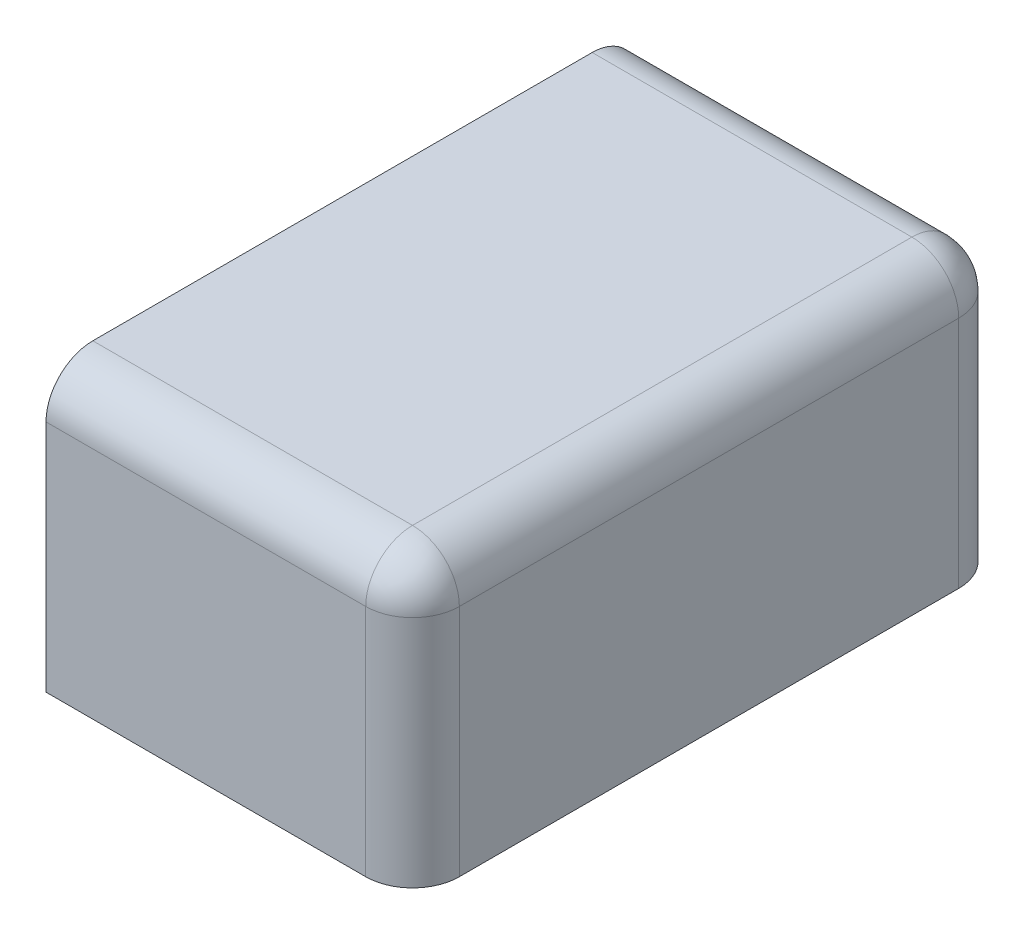
ISO-10303-21;
HEADER;
FILE_DESCRIPTION(('STEP AP214'),'2;1');
FILE_NAME('part.step','',(''),(''),'','','');
FILE_SCHEMA(('AUTOMOTIVE_DESIGN { 1 0 10303 214 1 1 1 1 }'));
ENDSEC;
DATA;
#1=APPLICATION_CONTEXT('core data for automotive mechanical design processes');
#2=APPLICATION_PROTOCOL_DEFINITION('international standard','automotive_design',2000,#1);
#3=PRODUCT_CONTEXT('',#1,'mechanical');
#4=PRODUCT('Part','Part','',(#3));
#5=PRODUCT_RELATED_PRODUCT_CATEGORY('part','',(#4));
#6=PRODUCT_DEFINITION_FORMATION('','',#4);
#7=PRODUCT_DEFINITION_CONTEXT('part definition',#1,'design');
#8=PRODUCT_DEFINITION('design','',#6,#7);
#9=PRODUCT_DEFINITION_SHAPE('','',#8);
#10=(LENGTH_UNIT() NAMED_UNIT(*) SI_UNIT(.MILLI.,.METRE.));
#11=(NAMED_UNIT(*) PLANE_ANGLE_UNIT() SI_UNIT($,.RADIAN.));
#12=(NAMED_UNIT(*) SI_UNIT($,.STERADIAN.) SOLID_ANGLE_UNIT());
#13=UNCERTAINTY_MEASURE_WITH_UNIT(LENGTH_MEASURE(1.E-05),#10,'distance_accuracy_value','');
#14=(GEOMETRIC_REPRESENTATION_CONTEXT(3) GLOBAL_UNCERTAINTY_ASSIGNED_CONTEXT((#13)) GLOBAL_UNIT_ASSIGNED_CONTEXT((#10,
#11,#12)) REPRESENTATION_CONTEXT('',''));
#15=CARTESIAN_POINT('',(0.,0.,0.));
#16=DIRECTION('',(0.,0.,1.));
#17=DIRECTION('',(1.,0.,0.));
#18=AXIS2_PLACEMENT_3D('',#15,#16,#17);
#19=CARTESIAN_POINT('',(-18.6436,28.575,30.1625));
#20=DIRECTION('',(1.,0.,0.));
#21=DIRECTION('',(0.,0.,-1.));
#22=AXIS2_PLACEMENT_3D('',#19,#20,#21);
#23=PLANE('',#22);
#24=DIRECTION('',(0.,-1.,0.));
#25=VECTOR('',#24,1.);
#26=CARTESIAN_POINT('',(-18.6436,28.575,-28.575));
#27=LINE('',#26,#25);
#28=CARTESIAN_POINT('',(-18.6436,23.8125,-28.575));
#29=VERTEX_POINT('',#28);
#30=CARTESIAN_POINT('',(-18.6436,0.,-28.575));
#31=VERTEX_POINT('',#30);
#32=EDGE_CURVE('E206',#29,#31,#27,.T.);
#33=ORIENTED_EDGE('',*,*,#32,.F.);
#34=CARTESIAN_POINT('',(-18.6436,23.8125,-25.4));
#35=DIRECTION('',(1.,0.,0.));
#36=DIRECTION('',(0.,0.,-1.));
#37=AXIS2_PLACEMENT_3D('',#34,#35,#36);
#38=CIRCLE('',#37,3.175);
#39=CARTESIAN_POINT('',(-18.6436,26.9875,-25.4));
#40=VERTEX_POINT('',#39);
#41=EDGE_CURVE('E189',#40,#29,#38,.F.);
#42=ORIENTED_EDGE('',*,*,#41,.F.);
#43=DIRECTION('',(0.,0.,1.));
#44=VECTOR('',#43,1.);
#45=CARTESIAN_POINT('',(-18.6436,26.9875,0.));
#46=LINE('',#45,#44);
#47=CARTESIAN_POINT('',(-18.6436,26.9875,25.4));
#48=VERTEX_POINT('',#47);
#49=EDGE_CURVE('E202',#40,#48,#46,.T.);
#50=ORIENTED_EDGE('',*,*,#49,.T.);
#51=CARTESIAN_POINT('',(-18.6436,23.8125,25.4));
#52=DIRECTION('',(1.,0.,0.));
#53=DIRECTION('',(0.,0.,-1.));
#54=AXIS2_PLACEMENT_3D('',#51,#52,#53);
#55=CIRCLE('',#54,3.175);
#56=CARTESIAN_POINT('',(-18.6436,23.8125,28.575));
#57=VERTEX_POINT('',#56);
#58=EDGE_CURVE('E207',#57,#48,#55,.F.);
#59=ORIENTED_EDGE('',*,*,#58,.F.);
#60=DIRECTION('',(0.,-1.,0.));
#61=VECTOR('',#60,1.);
#62=CARTESIAN_POINT('',(-18.6436,28.575,28.575));
#63=LINE('',#62,#61);
#64=CARTESIAN_POINT('',(-18.6436,0.,28.575));
#65=VERTEX_POINT('',#64);
#66=EDGE_CURVE('E203',#57,#65,#63,.T.);
#67=ORIENTED_EDGE('',*,*,#66,.T.);
#68=DIRECTION('',(0.,0.,1.));
#69=VECTOR('',#68,1.);
#70=CARTESIAN_POINT('',(-18.6436,0.,30.1625));
#71=LINE('',#70,#69);
#72=CARTESIAN_POINT('',(-18.6436,0.,30.1625));
#73=VERTEX_POINT('',#72);
#74=EDGE_CURVE('E229',#65,#73,#71,.T.);
#75=ORIENTED_EDGE('',*,*,#74,.T.);
#76=DIRECTION('',(0.,-1.,0.));
#77=VECTOR('',#76,1.);
#78=CARTESIAN_POINT('',(-18.6436,28.575,30.1625));
#79=LINE('',#78,#77);
#80=CARTESIAN_POINT('',(-18.6436,23.8125,30.1625));
#81=VERTEX_POINT('',#80);
#82=EDGE_CURVE('E222',#81,#73,#79,.T.);
#83=ORIENTED_EDGE('',*,*,#82,.F.);
#84=CARTESIAN_POINT('',(-18.6436,23.8125,25.4));
#85=DIRECTION('',(1.,0.,0.));
#86=DIRECTION('',(0.,0.,-1.));
#87=AXIS2_PLACEMENT_3D('',#84,#85,#86);
#88=CIRCLE('',#87,4.7625);
#89=CARTESIAN_POINT('',(-18.6436,28.575,25.4));
#90=VERTEX_POINT('',#89);
#91=EDGE_CURVE('E246',#81,#90,#88,.F.);
#92=ORIENTED_EDGE('',*,*,#91,.T.);
#93=DIRECTION('',(0.,0.,1.));
#94=VECTOR('',#93,1.);
#95=CARTESIAN_POINT('',(-18.6436,28.575,30.1625));
#96=LINE('',#95,#94);
#97=CARTESIAN_POINT('',(-18.6436,28.575,-25.4));
#98=VERTEX_POINT('',#97);
#99=EDGE_CURVE('E219',#98,#90,#96,.T.);
#100=ORIENTED_EDGE('',*,*,#99,.F.);
#101=CARTESIAN_POINT('',(-18.6436,23.8125,-25.4));
#102=DIRECTION('',(1.,0.,0.));
#103=DIRECTION('',(0.,0.,-1.));
#104=AXIS2_PLACEMENT_3D('',#101,#102,#103);
#105=CIRCLE('',#104,4.7625);
#106=CARTESIAN_POINT('',(-18.6436,23.8125,-30.1625));
#107=VERTEX_POINT('',#106);
#108=EDGE_CURVE('E248',#98,#107,#105,.F.);
#109=ORIENTED_EDGE('',*,*,#108,.T.);
#110=DIRECTION('',(0.,-1.,0.));
#111=VECTOR('',#110,1.);
#112=CARTESIAN_POINT('',(-18.6436,28.575,-30.1625));
#113=LINE('',#112,#111);
#114=CARTESIAN_POINT('',(-18.6436,0.,-30.1625));
#115=VERTEX_POINT('',#114);
#116=EDGE_CURVE('E236',#107,#115,#113,.T.);
#117=ORIENTED_EDGE('',*,*,#116,.T.);
#118=EDGE_CURVE('E230',#115,#31,#71,.T.);
#119=ORIENTED_EDGE('',*,*,#118,.T.);
#120=EDGE_LOOP('',(#33,#42,#50,#59,#67,#75,#83,#92,#100,#109,#117,#119));
#121=FACE_BOUND('',#120,.T.);
#122=ADVANCED_FACE('F35',(#121),#23,.F.);
#123=CARTESIAN_POINT('',(0.,0.,0.));
#124=DIRECTION('',(0.,-1.,0.));
#125=DIRECTION('',(0.,0.,-1.));
#126=AXIS2_PLACEMENT_3D('',#123,#124,#125);
#127=PLANE('',#126);
#128=CARTESIAN_POINT('',(13.8811,0.,-25.4));
#129=DIRECTION('',(0.,-1.,0.));
#130=DIRECTION('',(0.,0.,-1.));
#131=AXIS2_PLACEMENT_3D('',#128,#129,#130);
#132=CIRCLE('',#131,3.175);
#133=CARTESIAN_POINT('',(13.8811,0.,-28.575));
#134=VERTEX_POINT('',#133);
#135=CARTESIAN_POINT('',(17.0561,0.,-25.4));
#136=VERTEX_POINT('',#135);
#137=EDGE_CURVE('E157',#134,#136,#132,.T.);
#138=ORIENTED_EDGE('',*,*,#137,.F.);
#139=DIRECTION('',(-1.,0.,0.));
#140=VECTOR('',#139,1.);
#141=CARTESIAN_POINT('',(0.,0.,-28.575));
#142=LINE('',#141,#140);
#143=EDGE_CURVE('E194',#134,#31,#142,.T.);
#144=ORIENTED_EDGE('',*,*,#143,.T.);
#145=ORIENTED_EDGE('',*,*,#118,.F.);
#146=DIRECTION('',(-1.,0.,0.));
#147=VECTOR('',#146,1.);
#148=CARTESIAN_POINT('',(-18.6436,0.,-30.1625));
#149=LINE('',#148,#147);
#150=CARTESIAN_POINT('',(13.8811,0.,-30.1625));
#151=VERTEX_POINT('',#150);
#152=EDGE_CURVE('E227',#151,#115,#149,.T.);
#153=ORIENTED_EDGE('',*,*,#152,.F.);
#154=CARTESIAN_POINT('',(13.8811,0.,-25.4));
#155=DIRECTION('',(0.,-1.,0.));
#156=DIRECTION('',(0.,0.,-1.));
#157=AXIS2_PLACEMENT_3D('',#154,#155,#156);
#158=CIRCLE('',#157,4.7625);
#159=CARTESIAN_POINT('',(18.6436,0.,-25.4));
#160=VERTEX_POINT('',#159);
#161=EDGE_CURVE('E11',#151,#160,#158,.T.);
#162=ORIENTED_EDGE('',*,*,#161,.T.);
#163=DIRECTION('',(0.,0.,-1.));
#164=VECTOR('',#163,1.);
#165=CARTESIAN_POINT('',(18.6436,0.,30.1625));
#166=LINE('',#165,#164);
#167=CARTESIAN_POINT('',(18.6436,0.,25.4));
#168=VERTEX_POINT('',#167);
#169=EDGE_CURVE('E224',#168,#160,#166,.T.);
#170=ORIENTED_EDGE('',*,*,#169,.F.);
#171=CARTESIAN_POINT('',(13.8811,0.,25.4));
#172=DIRECTION('',(0.,-1.,0.));
#173=DIRECTION('',(0.,0.,-1.));
#174=AXIS2_PLACEMENT_3D('',#171,#172,#173);
#175=CIRCLE('',#174,4.7625);
#176=CARTESIAN_POINT('',(13.8811,0.,30.1625));
#177=VERTEX_POINT('',#176);
#178=EDGE_CURVE('E44',#168,#177,#175,.T.);
#179=ORIENTED_EDGE('',*,*,#178,.T.);
#180=DIRECTION('',(1.,0.,0.));
#181=VECTOR('',#180,1.);
#182=CARTESIAN_POINT('',(-18.6436,0.,30.1625));
#183=LINE('',#182,#181);
#184=EDGE_CURVE('E223',#73,#177,#183,.T.);
#185=ORIENTED_EDGE('',*,*,#184,.F.);
#186=ORIENTED_EDGE('',*,*,#74,.F.);
#187=DIRECTION('',(1.,0.,0.));
#188=VECTOR('',#187,1.);
#189=CARTESIAN_POINT('',(0.,0.,28.575));
#190=LINE('',#189,#188);
#191=CARTESIAN_POINT('',(13.8811,0.,28.575));
#192=VERTEX_POINT('',#191);
#193=EDGE_CURVE('E199',#65,#192,#190,.T.);
#194=ORIENTED_EDGE('',*,*,#193,.T.);
#195=CARTESIAN_POINT('',(13.8811,0.,25.4));
#196=DIRECTION('',(0.,-1.,0.));
#197=DIRECTION('',(0.,0.,-1.));
#198=AXIS2_PLACEMENT_3D('',#195,#196,#197);
#199=CIRCLE('',#198,3.175);
#200=CARTESIAN_POINT('',(17.0561,0.,25.4));
#201=VERTEX_POINT('',#200);
#202=EDGE_CURVE('E196',#201,#192,#199,.T.);
#203=ORIENTED_EDGE('',*,*,#202,.F.);
#204=DIRECTION('',(0.,0.,-1.));
#205=VECTOR('',#204,1.);
#206=CARTESIAN_POINT('',(17.0561,0.,0.));
#207=LINE('',#206,#205);
#208=EDGE_CURVE('E192',#201,#136,#207,.T.);
#209=ORIENTED_EDGE('',*,*,#208,.T.);
#210=EDGE_LOOP('',(#138,#144,#145,#153,#162,#170,#179,#185,#186,#194,#203,#209));
#211=FACE_BOUND('',#210,.T.);
#212=ADVANCED_FACE('F308',(#211),#127,.T.);
#213=CARTESIAN_POINT('',(18.6436,28.575,30.1625));
#214=DIRECTION('',(-1.,0.,0.));
#215=DIRECTION('',(0.,0.,1.));
#216=AXIS2_PLACEMENT_3D('',#213,#214,#215);
#217=PLANE('',#216);
#218=ORIENTED_EDGE('',*,*,#169,.T.);
#219=DIRECTION('',(0.,-1.,0.));
#220=VECTOR('',#219,1.);
#221=CARTESIAN_POINT('',(18.6436,28.575,-25.4));
#222=LINE('',#221,#220);
#223=CARTESIAN_POINT('',(18.6436,23.8125,-25.4));
#224=VERTEX_POINT('',#223);
#225=EDGE_CURVE('E258',#160,#224,#222,.F.);
#226=ORIENTED_EDGE('',*,*,#225,.T.);
#227=DIRECTION('',(0.,0.,-1.));
#228=VECTOR('',#227,1.);
#229=CARTESIAN_POINT('',(18.6436,23.8125,30.1625));
#230=LINE('',#229,#228);
#231=CARTESIAN_POINT('',(18.6436,23.8125,25.4));
#232=VERTEX_POINT('',#231);
#233=EDGE_CURVE('E256',#224,#232,#230,.F.);
#234=ORIENTED_EDGE('',*,*,#233,.T.);
#235=DIRECTION('',(0.,-1.,0.));
#236=VECTOR('',#235,1.);
#237=CARTESIAN_POINT('',(18.6436,28.575,25.4));
#238=LINE('',#237,#236);
#239=EDGE_CURVE('E254',#232,#168,#238,.T.);
#240=ORIENTED_EDGE('',*,*,#239,.T.);
#241=EDGE_LOOP('',(#218,#226,#234,#240));
#242=FACE_BOUND('',#241,.T.);
#243=ADVANCED_FACE('F313',(#242),#217,.F.);
#244=CARTESIAN_POINT('',(-18.6436,28.575,-30.1625));
#245=DIRECTION('',(0.,0.,1.));
#246=DIRECTION('',(1.,0.,0.));
#247=AXIS2_PLACEMENT_3D('',#244,#245,#246);
#248=PLANE('',#247);
#249=ORIENTED_EDGE('',*,*,#116,.F.);
#250=DIRECTION('',(-1.,0.,0.));
#251=VECTOR('',#250,1.);
#252=CARTESIAN_POINT('',(-18.6436,23.8125,-30.1625));
#253=LINE('',#252,#251);
#254=CARTESIAN_POINT('',(13.8811,23.8125,-30.1625));
#255=VERTEX_POINT('',#254);
#256=EDGE_CURVE('E252',#107,#255,#253,.F.);
#257=ORIENTED_EDGE('',*,*,#256,.T.);
#258=DIRECTION('',(0.,-1.,0.));
#259=VECTOR('',#258,1.);
#260=CARTESIAN_POINT('',(13.8811,28.575,-30.1625));
#261=LINE('',#260,#259);
#262=EDGE_CURVE('E250',#255,#151,#261,.T.);
#263=ORIENTED_EDGE('',*,*,#262,.T.);
#264=ORIENTED_EDGE('',*,*,#152,.T.);
#265=EDGE_LOOP('',(#249,#257,#263,#264));
#266=FACE_BOUND('',#265,.T.);
#267=ADVANCED_FACE('F328',(#266),#248,.F.);
#268=CARTESIAN_POINT('',(-18.6436,28.575,30.1625));
#269=DIRECTION('',(0.,0.,-1.));
#270=DIRECTION('',(-1.,0.,0.));
#271=AXIS2_PLACEMENT_3D('',#268,#269,#270);
#272=PLANE('',#271);
#273=DIRECTION('',(0.,-1.,0.));
#274=VECTOR('',#273,1.);
#275=CARTESIAN_POINT('',(13.8811,28.575,30.1625));
#276=LINE('',#275,#274);
#277=CARTESIAN_POINT('',(13.8811,23.8125,30.1625));
#278=VERTEX_POINT('',#277);
#279=EDGE_CURVE('E60',#177,#278,#276,.F.);
#280=ORIENTED_EDGE('',*,*,#279,.T.);
#281=DIRECTION('',(1.,0.,0.));
#282=VECTOR('',#281,1.);
#283=CARTESIAN_POINT('',(-18.6436,23.8125,30.1625));
#284=LINE('',#283,#282);
#285=EDGE_CURVE('E261',#278,#81,#284,.F.);
#286=ORIENTED_EDGE('',*,*,#285,.T.);
#287=ORIENTED_EDGE('',*,*,#82,.T.);
#288=ORIENTED_EDGE('',*,*,#184,.T.);
#289=EDGE_LOOP('',(#280,#286,#287,#288));
#290=FACE_BOUND('',#289,.T.);
#291=ADVANCED_FACE('F300',(#290),#272,.F.);
#292=CARTESIAN_POINT('',(0.,28.575,0.));
#293=DIRECTION('',(0.,-1.,0.));
#294=DIRECTION('',(0.,0.,-1.));
#295=AXIS2_PLACEMENT_3D('',#292,#293,#294);
#296=PLANE('',#295);
#297=DIRECTION('',(0.,0.,-1.));
#298=VECTOR('',#297,1.);
#299=CARTESIAN_POINT('',(13.8811,28.575,0.));
#300=LINE('',#299,#298);
#301=CARTESIAN_POINT('',(13.8811,28.575,25.4));
#302=VERTEX_POINT('',#301);
#303=CARTESIAN_POINT('',(13.8811,28.575,-25.4));
#304=VERTEX_POINT('',#303);
#305=EDGE_CURVE('E241',#302,#304,#300,.T.);
#306=ORIENTED_EDGE('',*,*,#305,.T.);
#307=DIRECTION('',(-1.,0.,0.));
#308=VECTOR('',#307,1.);
#309=CARTESIAN_POINT('',(0.,28.575,-25.4));
#310=LINE('',#309,#308);
#311=EDGE_CURVE('E243',#304,#98,#310,.T.);
#312=ORIENTED_EDGE('',*,*,#311,.T.);
#313=ORIENTED_EDGE('',*,*,#99,.T.);
#314=DIRECTION('',(1.,0.,0.));
#315=VECTOR('',#314,1.);
#316=CARTESIAN_POINT('',(0.,28.575,25.4));
#317=LINE('',#316,#315);
#318=EDGE_CURVE('E239',#90,#302,#317,.T.);
#319=ORIENTED_EDGE('',*,*,#318,.T.);
#320=EDGE_LOOP('',(#306,#312,#313,#319));
#321=FACE_BOUND('',#320,.T.);
#322=ADVANCED_FACE('F292',(#321),#296,.F.);
#323=CARTESIAN_POINT('',(13.8811,28.575,25.4));
#324=DIRECTION('',(0.,-1.,0.));
#325=DIRECTION('',(0.,0.,-1.));
#326=AXIS2_PLACEMENT_3D('',#323,#324,#325);
#327=CYLINDRICAL_SURFACE('',#326,4.7625);
#328=ORIENTED_EDGE('',*,*,#178,.F.);
#329=ORIENTED_EDGE('',*,*,#239,.F.);
#330=CARTESIAN_POINT('',(13.8811,23.8125,25.4));
#331=DIRECTION('',(0.,1.,0.));
#332=DIRECTION('',(0.,0.,1.));
#333=AXIS2_PLACEMENT_3D('',#330,#331,#332);
#334=CIRCLE('',#333,4.7625);
#335=EDGE_CURVE('E39',#278,#232,#334,.T.);
#336=ORIENTED_EDGE('',*,*,#335,.F.);
#337=ORIENTED_EDGE('',*,*,#279,.F.);
#338=EDGE_LOOP('',(#328,#329,#336,#337));
#339=FACE_BOUND('',#338,.T.);
#340=ADVANCED_FACE('F37',(#339),#327,.T.);
#341=CARTESIAN_POINT('',(0.,23.8125,25.4));
#342=DIRECTION('',(1.,0.,0.));
#343=DIRECTION('',(0.,0.,-1.));
#344=AXIS2_PLACEMENT_3D('',#341,#342,#343);
#345=CYLINDRICAL_SURFACE('',#344,4.7625);
#346=ORIENTED_EDGE('',*,*,#91,.F.);
#347=ORIENTED_EDGE('',*,*,#285,.F.);
#348=CARTESIAN_POINT('',(13.8811,23.8125,25.4));
#349=DIRECTION('',(1.,0.,0.));
#350=DIRECTION('',(0.,0.,-1.));
#351=AXIS2_PLACEMENT_3D('',#348,#349,#350);
#352=CIRCLE('',#351,4.7625);
#353=EDGE_CURVE('E274',#302,#278,#352,.T.);
#354=ORIENTED_EDGE('',*,*,#353,.F.);
#355=ORIENTED_EDGE('',*,*,#318,.F.);
#356=EDGE_LOOP('',(#346,#347,#354,#355));
#357=FACE_BOUND('',#356,.T.);
#358=ADVANCED_FACE('F298',(#357),#345,.T.);
#359=CARTESIAN_POINT('',(13.8811,23.8125,25.4));
#360=DIRECTION('',(0.,0.,1.));
#361=DIRECTION('',(1.,0.,0.));
#362=AXIS2_PLACEMENT_3D('',#359,#360,#361);
#363=SPHERICAL_SURFACE('',#362,4.7625);
#364=ORIENTED_EDGE('',*,*,#353,.T.);
#365=ORIENTED_EDGE('',*,*,#335,.T.);
#366=CARTESIAN_POINT('',(13.8811,23.8125,25.4));
#367=DIRECTION('',(0.,0.,1.));
#368=DIRECTION('',(1.,0.,0.));
#369=AXIS2_PLACEMENT_3D('',#366,#367,#368);
#370=CIRCLE('',#369,4.7625);
#371=EDGE_CURVE('E272',#302,#232,#370,.F.);
#372=ORIENTED_EDGE('',*,*,#371,.F.);
#373=EDGE_LOOP('',(#364,#365,#372));
#374=FACE_BOUND('',#373,.T.);
#375=ADVANCED_FACE('F281',(#374),#363,.T.);
#376=CARTESIAN_POINT('',(13.8811,28.575,-25.4));
#377=DIRECTION('',(0.,-1.,0.));
#378=DIRECTION('',(0.,0.,-1.));
#379=AXIS2_PLACEMENT_3D('',#376,#377,#378);
#380=CYLINDRICAL_SURFACE('',#379,4.7625);
#381=ORIENTED_EDGE('',*,*,#161,.F.);
#382=ORIENTED_EDGE('',*,*,#262,.F.);
#383=CARTESIAN_POINT('',(13.8811,23.8125,-25.4));
#384=DIRECTION('',(0.,1.,0.));
#385=DIRECTION('',(0.,0.,1.));
#386=AXIS2_PLACEMENT_3D('',#383,#384,#385);
#387=CIRCLE('',#386,4.7625);
#388=EDGE_CURVE('E269',#224,#255,#387,.T.);
#389=ORIENTED_EDGE('',*,*,#388,.F.);
#390=ORIENTED_EDGE('',*,*,#225,.F.);
#391=EDGE_LOOP('',(#381,#382,#389,#390));
#392=FACE_BOUND('',#391,.T.);
#393=ADVANCED_FACE('F320',(#392),#380,.T.);
#394=CARTESIAN_POINT('',(13.8811,23.8125,0.));
#395=DIRECTION('',(0.,0.,-1.));
#396=DIRECTION('',(-1.,0.,0.));
#397=AXIS2_PLACEMENT_3D('',#394,#395,#396);
#398=CYLINDRICAL_SURFACE('',#397,4.7625);
#399=ORIENTED_EDGE('',*,*,#371,.T.);
#400=ORIENTED_EDGE('',*,*,#233,.F.);
#401=CARTESIAN_POINT('',(13.8811,23.8125,-25.4));
#402=DIRECTION('',(0.,0.,-1.));
#403=DIRECTION('',(-1.,0.,0.));
#404=AXIS2_PLACEMENT_3D('',#401,#402,#403);
#405=CIRCLE('',#404,4.7625);
#406=EDGE_CURVE('E266',#304,#224,#405,.T.);
#407=ORIENTED_EDGE('',*,*,#406,.F.);
#408=ORIENTED_EDGE('',*,*,#305,.F.);
#409=EDGE_LOOP('',(#399,#400,#407,#408));
#410=FACE_BOUND('',#409,.T.);
#411=ADVANCED_FACE('F287',(#410),#398,.T.);
#412=CARTESIAN_POINT('',(13.8811,23.8125,-25.4));
#413=DIRECTION('',(0.,0.,1.));
#414=DIRECTION('',(1.,0.,0.));
#415=AXIS2_PLACEMENT_3D('',#412,#413,#414);
#416=SPHERICAL_SURFACE('',#415,4.7625);
#417=ORIENTED_EDGE('',*,*,#406,.T.);
#418=ORIENTED_EDGE('',*,*,#388,.T.);
#419=CARTESIAN_POINT('',(13.8811,23.8125,-25.4));
#420=DIRECTION('',(1.,0.,0.));
#421=DIRECTION('',(0.,1.,0.));
#422=AXIS2_PLACEMENT_3D('',#419,#420,#421);
#423=CIRCLE('',#422,4.7625);
#424=EDGE_CURVE('E218',#304,#255,#423,.F.);
#425=ORIENTED_EDGE('',*,*,#424,.F.);
#426=EDGE_LOOP('',(#417,#418,#425));
#427=FACE_BOUND('',#426,.T.);
#428=ADVANCED_FACE('F322',(#427),#416,.T.);
#429=CARTESIAN_POINT('',(0.,23.8125,-25.4));
#430=DIRECTION('',(-1.,0.,0.));
#431=DIRECTION('',(0.,0.,1.));
#432=AXIS2_PLACEMENT_3D('',#429,#430,#431);
#433=CYLINDRICAL_SURFACE('',#432,4.7625);
#434=ORIENTED_EDGE('',*,*,#424,.T.);
#435=ORIENTED_EDGE('',*,*,#256,.F.);
#436=ORIENTED_EDGE('',*,*,#108,.F.);
#437=ORIENTED_EDGE('',*,*,#311,.F.);
#438=EDGE_LOOP('',(#434,#435,#436,#437));
#439=FACE_BOUND('',#438,.T.);
#440=ADVANCED_FACE('F325',(#439),#433,.T.);
#441=CARTESIAN_POINT('',(17.0561,28.575,30.1625));
#442=DIRECTION('',(-1.,0.,0.));
#443=DIRECTION('',(0.,0.,1.));
#444=AXIS2_PLACEMENT_3D('',#441,#442,#443);
#445=PLANE('',#444);
#446=ORIENTED_EDGE('',*,*,#208,.F.);
#447=DIRECTION('',(0.,1.,0.));
#448=VECTOR('',#447,1.);
#449=CARTESIAN_POINT('',(17.0561,28.575,25.4));
#450=LINE('',#449,#448);
#451=CARTESIAN_POINT('',(17.0561,23.8125,25.4));
#452=VERTEX_POINT('',#451);
#453=EDGE_CURVE('E165',#452,#201,#450,.F.);
#454=ORIENTED_EDGE('',*,*,#453,.F.);
#455=DIRECTION('',(0.,0.,1.));
#456=VECTOR('',#455,1.);
#457=CARTESIAN_POINT('',(17.0561,23.8125,30.1625));
#458=LINE('',#457,#456);
#459=CARTESIAN_POINT('',(17.0561,23.8125,-25.4));
#460=VERTEX_POINT('',#459);
#461=EDGE_CURVE('E161',#460,#452,#458,.T.);
#462=ORIENTED_EDGE('',*,*,#461,.F.);
#463=DIRECTION('',(0.,1.,0.));
#464=VECTOR('',#463,1.);
#465=CARTESIAN_POINT('',(17.0561,28.575,-25.4));
#466=LINE('',#465,#464);
#467=EDGE_CURVE('E150',#136,#460,#466,.T.);
#468=ORIENTED_EDGE('',*,*,#467,.F.);
#469=EDGE_LOOP('',(#446,#454,#462,#468));
#470=FACE_BOUND('',#469,.T.);
#471=ADVANCED_FACE('F164',(#470),#445,.T.);
#472=CARTESIAN_POINT('',(-18.6436,28.575,-28.575));
#473=DIRECTION('',(0.,0.,1.));
#474=DIRECTION('',(1.,0.,0.));
#475=AXIS2_PLACEMENT_3D('',#472,#473,#474);
#476=PLANE('',#475);
#477=ORIENTED_EDGE('',*,*,#32,.T.);
#478=ORIENTED_EDGE('',*,*,#143,.F.);
#479=DIRECTION('',(0.,1.,0.));
#480=VECTOR('',#479,1.);
#481=CARTESIAN_POINT('',(13.8811,28.575,-28.575));
#482=LINE('',#481,#480);
#483=CARTESIAN_POINT('',(13.8811,23.8125,-28.575));
#484=VERTEX_POINT('',#483);
#485=EDGE_CURVE('E187',#484,#134,#482,.F.);
#486=ORIENTED_EDGE('',*,*,#485,.F.);
#487=DIRECTION('',(1.,0.,0.));
#488=VECTOR('',#487,1.);
#489=CARTESIAN_POINT('',(-18.6436,23.8125,-28.575));
#490=LINE('',#489,#488);
#491=EDGE_CURVE('E188',#29,#484,#490,.T.);
#492=ORIENTED_EDGE('',*,*,#491,.F.);
#493=EDGE_LOOP('',(#477,#478,#486,#492));
#494=FACE_BOUND('',#493,.T.);
#495=ADVANCED_FACE('F375',(#494),#476,.T.);
#496=CARTESIAN_POINT('',(-18.6436,28.575,28.575));
#497=DIRECTION('',(0.,0.,-1.));
#498=DIRECTION('',(-1.,0.,0.));
#499=AXIS2_PLACEMENT_3D('',#496,#497,#498);
#500=PLANE('',#499);
#501=DIRECTION('',(0.,1.,0.));
#502=VECTOR('',#501,1.);
#503=CARTESIAN_POINT('',(13.8811,28.575,28.575));
#504=LINE('',#503,#502);
#505=CARTESIAN_POINT('',(13.8811,23.8125,28.575));
#506=VERTEX_POINT('',#505);
#507=EDGE_CURVE('E52',#192,#506,#504,.T.);
#508=ORIENTED_EDGE('',*,*,#507,.F.);
#509=ORIENTED_EDGE('',*,*,#193,.F.);
#510=ORIENTED_EDGE('',*,*,#66,.F.);
#511=DIRECTION('',(-1.,0.,0.));
#512=VECTOR('',#511,1.);
#513=CARTESIAN_POINT('',(-18.6436,23.8125,28.575));
#514=LINE('',#513,#512);
#515=EDGE_CURVE('E198',#506,#57,#514,.T.);
#516=ORIENTED_EDGE('',*,*,#515,.F.);
#517=EDGE_LOOP('',(#508,#509,#510,#516));
#518=FACE_BOUND('',#517,.T.);
#519=ADVANCED_FACE('F371',(#518),#500,.T.);
#520=CARTESIAN_POINT('',(0.,26.9875,0.));
#521=DIRECTION('',(0.,-1.,0.));
#522=DIRECTION('',(0.,0.,-1.));
#523=AXIS2_PLACEMENT_3D('',#520,#521,#522);
#524=PLANE('',#523);
#525=DIRECTION('',(0.,0.,-1.));
#526=VECTOR('',#525,1.);
#527=CARTESIAN_POINT('',(13.8811,26.9875,0.));
#528=LINE('',#527,#526);
#529=CARTESIAN_POINT('',(13.8811,26.9875,25.4));
#530=VERTEX_POINT('',#529);
#531=CARTESIAN_POINT('',(13.8811,26.9875,-25.4));
#532=VERTEX_POINT('',#531);
#533=EDGE_CURVE('E181',#530,#532,#528,.T.);
#534=ORIENTED_EDGE('',*,*,#533,.F.);
#535=DIRECTION('',(1.,0.,0.));
#536=VECTOR('',#535,1.);
#537=CARTESIAN_POINT('',(0.,26.9875,25.4));
#538=LINE('',#537,#536);
#539=EDGE_CURVE('E214',#48,#530,#538,.T.);
#540=ORIENTED_EDGE('',*,*,#539,.F.);
#541=ORIENTED_EDGE('',*,*,#49,.F.);
#542=DIRECTION('',(1.,0.,0.));
#543=VECTOR('',#542,1.);
#544=CARTESIAN_POINT('',(0.,26.9875,-25.4));
#545=LINE('',#544,#543);
#546=EDGE_CURVE('E209',#532,#40,#545,.F.);
#547=ORIENTED_EDGE('',*,*,#546,.F.);
#548=EDGE_LOOP('',(#534,#540,#541,#547));
#549=FACE_BOUND('',#548,.T.);
#550=ADVANCED_FACE('F367',(#549),#524,.T.);
#551=CARTESIAN_POINT('',(13.8811,28.575,25.4));
#552=DIRECTION('',(0.,-1.,0.));
#553=DIRECTION('',(0.,0.,-1.));
#554=AXIS2_PLACEMENT_3D('',#551,#552,#553);
#555=CYLINDRICAL_SURFACE('',#554,3.175);
#556=ORIENTED_EDGE('',*,*,#202,.T.);
#557=ORIENTED_EDGE('',*,*,#507,.T.);
#558=CARTESIAN_POINT('',(13.8811,23.8125,25.4));
#559=DIRECTION('',(0.,-1.,0.));
#560=DIRECTION('',(0.,0.,-1.));
#561=AXIS2_PLACEMENT_3D('',#558,#559,#560);
#562=CIRCLE('',#561,3.175);
#563=EDGE_CURVE('E195',#506,#452,#562,.F.);
#564=ORIENTED_EDGE('',*,*,#563,.T.);
#565=ORIENTED_EDGE('',*,*,#453,.T.);
#566=EDGE_LOOP('',(#556,#557,#564,#565));
#567=FACE_BOUND('',#566,.T.);
#568=ADVANCED_FACE('F363',(#567),#555,.F.);
#569=CARTESIAN_POINT('',(0.,23.8125,25.4));
#570=DIRECTION('',(1.,0.,0.));
#571=DIRECTION('',(0.,0.,-1.));
#572=AXIS2_PLACEMENT_3D('',#569,#570,#571);
#573=CYLINDRICAL_SURFACE('',#572,3.175);
#574=ORIENTED_EDGE('',*,*,#58,.T.);
#575=ORIENTED_EDGE('',*,*,#539,.T.);
#576=CARTESIAN_POINT('',(13.8811,23.8125,25.4));
#577=DIRECTION('',(1.,0.,0.));
#578=DIRECTION('',(0.,1.,0.));
#579=AXIS2_PLACEMENT_3D('',#576,#577,#578);
#580=CIRCLE('',#579,3.175);
#581=EDGE_CURVE('E541',#530,#506,#580,.T.);
#582=ORIENTED_EDGE('',*,*,#581,.T.);
#583=ORIENTED_EDGE('',*,*,#515,.T.);
#584=EDGE_LOOP('',(#574,#575,#582,#583));
#585=FACE_BOUND('',#584,.T.);
#586=ADVANCED_FACE('F359',(#585),#573,.F.);
#587=CARTESIAN_POINT('',(13.8811,23.8125,25.4));
#588=DIRECTION('',(0.,0.,1.));
#589=DIRECTION('',(1.,0.,0.));
#590=AXIS2_PLACEMENT_3D('',#587,#588,#589);
#591=SPHERICAL_SURFACE('',#590,3.175);
#592=ORIENTED_EDGE('',*,*,#581,.F.);
#593=CARTESIAN_POINT('',(13.8811,23.8125,25.4));
#594=DIRECTION('',(0.,0.,-1.));
#595=DIRECTION('',(-1.,0.,0.));
#596=AXIS2_PLACEMENT_3D('',#593,#594,#595);
#597=CIRCLE('',#596,3.175);
#598=EDGE_CURVE('E177',#530,#452,#597,.T.);
#599=ORIENTED_EDGE('',*,*,#598,.T.);
#600=ORIENTED_EDGE('',*,*,#563,.F.);
#601=EDGE_LOOP('',(#592,#599,#600));
#602=FACE_BOUND('',#601,.T.);
#603=ADVANCED_FACE('F356',(#602),#591,.F.);
#604=CARTESIAN_POINT('',(13.8811,28.575,-25.4));
#605=DIRECTION('',(0.,-1.,0.));
#606=DIRECTION('',(0.,0.,-1.));
#607=AXIS2_PLACEMENT_3D('',#604,#605,#606);
#608=CYLINDRICAL_SURFACE('',#607,3.175);
#609=ORIENTED_EDGE('',*,*,#137,.T.);
#610=ORIENTED_EDGE('',*,*,#467,.T.);
#611=CARTESIAN_POINT('',(13.8811,23.8125,-25.4));
#612=DIRECTION('',(0.,-1.,0.));
#613=DIRECTION('',(0.,0.,-1.));
#614=AXIS2_PLACEMENT_3D('',#611,#612,#613);
#615=CIRCLE('',#614,3.175);
#616=EDGE_CURVE('E154',#460,#484,#615,.F.);
#617=ORIENTED_EDGE('',*,*,#616,.T.);
#618=ORIENTED_EDGE('',*,*,#485,.T.);
#619=EDGE_LOOP('',(#609,#610,#617,#618));
#620=FACE_BOUND('',#619,.T.);
#621=ADVANCED_FACE('F152',(#620),#608,.F.);
#622=CARTESIAN_POINT('',(13.8811,23.8125,0.));
#623=DIRECTION('',(0.,0.,-1.));
#624=DIRECTION('',(-1.,0.,0.));
#625=AXIS2_PLACEMENT_3D('',#622,#623,#624);
#626=CYLINDRICAL_SURFACE('',#625,3.175);
#627=ORIENTED_EDGE('',*,*,#598,.F.);
#628=ORIENTED_EDGE('',*,*,#533,.T.);
#629=CARTESIAN_POINT('',(13.8811,23.8125,-25.4));
#630=DIRECTION('',(0.,0.,1.));
#631=DIRECTION('',(1.,0.,0.));
#632=AXIS2_PLACEMENT_3D('',#629,#630,#631);
#633=CIRCLE('',#632,3.175);
#634=EDGE_CURVE('E174',#532,#460,#633,.F.);
#635=ORIENTED_EDGE('',*,*,#634,.T.);
#636=ORIENTED_EDGE('',*,*,#461,.T.);
#637=EDGE_LOOP('',(#627,#628,#635,#636));
#638=FACE_BOUND('',#637,.T.);
#639=ADVANCED_FACE('F179',(#638),#626,.F.);
#640=CARTESIAN_POINT('',(13.8811,23.8125,-25.4));
#641=DIRECTION('',(0.,0.,1.));
#642=DIRECTION('',(1.,0.,0.));
#643=AXIS2_PLACEMENT_3D('',#640,#641,#642);
#644=SPHERICAL_SURFACE('',#643,3.175);
#645=ORIENTED_EDGE('',*,*,#634,.F.);
#646=CARTESIAN_POINT('',(13.8811,23.8125,-25.4));
#647=DIRECTION('',(-1.,0.,0.));
#648=DIRECTION('',(0.,0.,1.));
#649=AXIS2_PLACEMENT_3D('',#646,#647,#648);
#650=CIRCLE('',#649,3.175);
#651=EDGE_CURVE('E176',#532,#484,#650,.T.);
#652=ORIENTED_EDGE('',*,*,#651,.T.);
#653=ORIENTED_EDGE('',*,*,#616,.F.);
#654=EDGE_LOOP('',(#645,#652,#653));
#655=FACE_BOUND('',#654,.T.);
#656=ADVANCED_FACE('F173',(#655),#644,.F.);
#657=CARTESIAN_POINT('',(0.,23.8125,-25.4));
#658=DIRECTION('',(-1.,0.,0.));
#659=DIRECTION('',(0.,0.,1.));
#660=AXIS2_PLACEMENT_3D('',#657,#658,#659);
#661=CYLINDRICAL_SURFACE('',#660,3.175);
#662=ORIENTED_EDGE('',*,*,#651,.F.);
#663=ORIENTED_EDGE('',*,*,#546,.T.);
#664=ORIENTED_EDGE('',*,*,#41,.T.);
#665=ORIENTED_EDGE('',*,*,#491,.T.);
#666=EDGE_LOOP('',(#662,#663,#664,#665));
#667=FACE_BOUND('',#666,.T.);
#668=ADVANCED_FACE('F346',(#667),#661,.F.);
#669=CLOSED_SHELL('',(#122,#212,#243,#267,#291,#322,#340,#358,#375,#393,#411,#428,#440,#471,
#495,#519,#550,#568,#586,#603,#621,#639,#656,#668));
#670=MANIFOLD_SOLID_BREP('B2',#669);
#671=ADVANCED_BREP_SHAPE_REPRESENTATION('',(#18,#670),#14);
#672=SHAPE_DEFINITION_REPRESENTATION(#9,#671);
ENDSEC;
END-ISO-10303-21;
